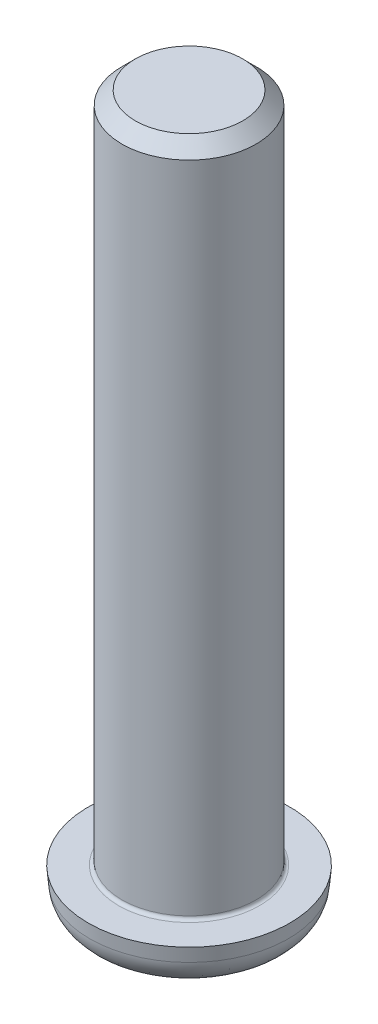
ISO-10303-21;
HEADER;
FILE_DESCRIPTION(('STEP AP214'),'2;1');
FILE_NAME('part.step','',(''),(''),'','','');
FILE_SCHEMA(('AUTOMOTIVE_DESIGN { 1 0 10303 214 1 1 1 1 }'));
ENDSEC;
DATA;
#1=APPLICATION_CONTEXT('core data for automotive mechanical design processes');
#2=APPLICATION_PROTOCOL_DEFINITION('international standard','automotive_design',2000,#1);
#3=PRODUCT_CONTEXT('',#1,'mechanical');
#4=PRODUCT('Part','Part','',(#3));
#5=PRODUCT_RELATED_PRODUCT_CATEGORY('part','',(#4));
#6=PRODUCT_DEFINITION_FORMATION('','',#4);
#7=PRODUCT_DEFINITION_CONTEXT('part definition',#1,'design');
#8=PRODUCT_DEFINITION('design','',#6,#7);
#9=PRODUCT_DEFINITION_SHAPE('','',#8);
#10=(LENGTH_UNIT() NAMED_UNIT(*) SI_UNIT(.MILLI.,.METRE.));
#11=(NAMED_UNIT(*) PLANE_ANGLE_UNIT() SI_UNIT($,.RADIAN.));
#12=(NAMED_UNIT(*) SI_UNIT($,.STERADIAN.) SOLID_ANGLE_UNIT());
#13=UNCERTAINTY_MEASURE_WITH_UNIT(LENGTH_MEASURE(1.E-05),#10,'distance_accuracy_value','');
#14=(GEOMETRIC_REPRESENTATION_CONTEXT(3) GLOBAL_UNCERTAINTY_ASSIGNED_CONTEXT((#13)) GLOBAL_UNIT_ASSIGNED_CONTEXT((#10,
#11,#12)) REPRESENTATION_CONTEXT('',''));
#15=CARTESIAN_POINT('',(0.,0.,0.));
#16=DIRECTION('',(0.,0.,1.));
#17=DIRECTION('',(1.,0.,0.));
#18=AXIS2_PLACEMENT_3D('',#15,#16,#17);
#19=CARTESIAN_POINT('',(0.,0.,1.));
#20=DIRECTION('',(0.,1.,0.));
#21=DIRECTION('',(0.,0.,1.));
#22=AXIS2_PLACEMENT_3D('',#19,#20,#21);
#23=PLANE('',#22);
#24=CARTESIAN_POINT('',(0.,0.,0.));
#25=DIRECTION('',(0.,1.,0.));
#26=DIRECTION('',(0.,0.,1.));
#27=AXIS2_PLACEMENT_3D('',#24,#25,#26);
#28=CIRCLE('',#27,1.05);
#29=CARTESIAN_POINT('',(0.,0.,1.05));
#30=VERTEX_POINT('',#29);
#31=EDGE_CURVE('E251',#30,#30,#28,.F.);
#32=ORIENTED_EDGE('',*,*,#31,.T.);
#33=EDGE_LOOP('',(#32));
#34=FACE_BOUND('',#33,.T.);
#35=CARTESIAN_POINT('',(0.,0.,0.));
#36=DIRECTION('',(0.,1.,0.));
#37=DIRECTION('',(0.,0.,1.));
#38=AXIS2_PLACEMENT_3D('',#35,#36,#37);
#39=CIRCLE('',#38,1.5);
#40=CARTESIAN_POINT('',(0.,0.,1.5));
#41=VERTEX_POINT('',#40);
#42=EDGE_CURVE('E239',#41,#41,#39,.T.);
#43=ORIENTED_EDGE('',*,*,#42,.T.);
#44=EDGE_LOOP('',(#43));
#45=FACE_BOUND('',#44,.T.);
#46=ADVANCED_FACE('F43',(#34,#45),#23,.T.);
#47=CARTESIAN_POINT('',(0.,0.,0.));
#48=DIRECTION('',(0.,1.,0.));
#49=DIRECTION('',(0.,0.,1.));
#50=AXIS2_PLACEMENT_3D('',#47,#48,#49);
#51=CONICAL_SURFACE('',#50,1.5,0.087266462599715);
#52=CARTESIAN_POINT('',(0.,-0.21,0.));
#53=DIRECTION('',(0.,1.,0.));
#54=DIRECTION('',(0.,0.,1.));
#55=AXIS2_PLACEMENT_3D('',#52,#53,#54);
#56=CIRCLE('',#55,1.48162738065956);
#57=CARTESIAN_POINT('',(0.,-0.21,1.48162738065956));
#58=VERTEX_POINT('',#57);
#59=EDGE_CURVE('E187',#58,#58,#56,.T.);
#60=ORIENTED_EDGE('',*,*,#59,.T.);
#61=EDGE_LOOP('',(#60));
#62=FACE_BOUND('',#61,.T.);
#63=ORIENTED_EDGE('',*,*,#42,.F.);
#64=EDGE_LOOP('',(#63));
#65=FACE_BOUND('',#64,.T.);
#66=ADVANCED_FACE('F268',(#62,#65),#51,.T.);
#67=CARTESIAN_POINT('',(0.,-0.169099911978679,0.));
#68=DIRECTION('',(0.,1.,0.));
#69=DIRECTION('',(0.,0.,1.));
#70=AXIS2_PLACEMENT_3D('',#67,#68,#69);
#71=TOROIDAL_SURFACE('',#70,1.01413723538831,0.469275881679299);
#72=CARTESIAN_POINT('',(0.,-0.571497043538653,0.));
#73=DIRECTION('',(0.,1.,0.));
#74=DIRECTION('',(0.,0.,1.));
#75=AXIS2_PLACEMENT_3D('',#72,#73,#74);
#76=CIRCLE('',#75,1.25558371318036);
#77=CARTESIAN_POINT('',(0.,-0.571497043538653,1.25558371318036));
#78=VERTEX_POINT('',#77);
#79=EDGE_CURVE('E242',#78,#78,#76,.T.);
#80=ORIENTED_EDGE('',*,*,#79,.T.);
#81=EDGE_LOOP('',(#80));
#82=FACE_BOUND('',#81,.T.);
#83=ORIENTED_EDGE('',*,*,#59,.F.);
#84=EDGE_LOOP('',(#83));
#85=FACE_BOUND('',#84,.T.);
#86=ADVANCED_FACE('F274',(#82,#85),#71,.T.);
#87=CARTESIAN_POINT('',(0.,-0.6,0.));
#88=DIRECTION('',(0.,-1.,0.));
#89=DIRECTION('',(0.,0.,-1.));
#90=AXIS2_PLACEMENT_3D('',#87,#88,#89);
#91=PLANE('',#90);
#92=DIRECTION('',(0.,0.,-1.));
#93=VECTOR('',#92,1.);
#94=CARTESIAN_POINT('',(-0.15725,-0.6,0.925));
#95=LINE('',#94,#93);
#96=CARTESIAN_POINT('',(-0.15725,-0.6,0.925));
#97=VERTEX_POINT('',#96);
#98=CARTESIAN_POINT('',(-0.15725,-0.6,0.15725));
#99=VERTEX_POINT('',#98);
#100=EDGE_CURVE('E58',#97,#99,#95,.T.);
#101=ORIENTED_EDGE('',*,*,#100,.F.);
#102=DIRECTION('',(-1.,0.,0.));
#103=VECTOR('',#102,1.);
#104=CARTESIAN_POINT('',(-0.15725,-0.6,0.925));
#105=LINE('',#104,#103);
#106=CARTESIAN_POINT('',(0.15725,-0.6,0.925));
#107=VERTEX_POINT('',#106);
#108=EDGE_CURVE('E183',#107,#97,#105,.T.);
#109=ORIENTED_EDGE('',*,*,#108,.F.);
#110=DIRECTION('',(0.,0.,1.));
#111=VECTOR('',#110,1.);
#112=CARTESIAN_POINT('',(0.15725,-0.6,0.925));
#113=LINE('',#112,#111);
#114=CARTESIAN_POINT('',(0.157250000000001,-0.6,0.15725));
#115=VERTEX_POINT('',#114);
#116=EDGE_CURVE('E181',#115,#107,#113,.T.);
#117=ORIENTED_EDGE('',*,*,#116,.F.);
#118=DIRECTION('',(-1.,0.,0.));
#119=VECTOR('',#118,1.);
#120=CARTESIAN_POINT('',(0.157250000000001,-0.6,0.15725));
#121=LINE('',#120,#119);
#122=CARTESIAN_POINT('',(0.925,-0.6,0.15725));
#123=VERTEX_POINT('',#122);
#124=EDGE_CURVE('E178',#123,#115,#121,.T.);
#125=ORIENTED_EDGE('',*,*,#124,.F.);
#126=DIRECTION('',(0.,0.,1.));
#127=VECTOR('',#126,1.);
#128=CARTESIAN_POINT('',(0.925,-0.6,0.15725));
#129=LINE('',#128,#127);
#130=CARTESIAN_POINT('',(0.925,-0.6,-0.15725));
#131=VERTEX_POINT('',#130);
#132=EDGE_CURVE('E175',#131,#123,#129,.T.);
#133=ORIENTED_EDGE('',*,*,#132,.F.);
#134=DIRECTION('',(1.,0.,0.));
#135=VECTOR('',#134,1.);
#136=CARTESIAN_POINT('',(0.157250000000001,-0.6,-0.15725));
#137=LINE('',#136,#135);
#138=CARTESIAN_POINT('',(0.157250000000001,-0.6,-0.15725));
#139=VERTEX_POINT('',#138);
#140=EDGE_CURVE('E172',#139,#131,#137,.T.);
#141=ORIENTED_EDGE('',*,*,#140,.F.);
#142=DIRECTION('',(0.,0.,1.));
#143=VECTOR('',#142,1.);
#144=CARTESIAN_POINT('',(0.157250000000001,-0.6,-0.15725));
#145=LINE('',#144,#143);
#146=CARTESIAN_POINT('',(0.157250000000001,-0.6,-0.925));
#147=VERTEX_POINT('',#146);
#148=EDGE_CURVE('E169',#147,#139,#145,.T.);
#149=ORIENTED_EDGE('',*,*,#148,.F.);
#150=DIRECTION('',(1.,0.,0.));
#151=VECTOR('',#150,1.);
#152=CARTESIAN_POINT('',(-0.15725,-0.6,-0.925));
#153=LINE('',#152,#151);
#154=CARTESIAN_POINT('',(-0.15725,-0.6,-0.925));
#155=VERTEX_POINT('',#154);
#156=EDGE_CURVE('E166',#155,#147,#153,.T.);
#157=ORIENTED_EDGE('',*,*,#156,.F.);
#158=DIRECTION('',(0.,0.,-1.));
#159=VECTOR('',#158,1.);
#160=CARTESIAN_POINT('',(-0.15725,-0.6,-0.15725));
#161=LINE('',#160,#159);
#162=CARTESIAN_POINT('',(-0.15725,-0.6,-0.15725));
#163=VERTEX_POINT('',#162);
#164=EDGE_CURVE('E160',#163,#155,#161,.T.);
#165=ORIENTED_EDGE('',*,*,#164,.F.);
#166=DIRECTION('',(1.,0.,0.));
#167=VECTOR('',#166,1.);
#168=CARTESIAN_POINT('',(-0.925,-0.6,-0.15725));
#169=LINE('',#168,#167);
#170=CARTESIAN_POINT('',(-0.925,-0.6,-0.15725));
#171=VERTEX_POINT('',#170);
#172=EDGE_CURVE('E158',#171,#163,#169,.T.);
#173=ORIENTED_EDGE('',*,*,#172,.F.);
#174=DIRECTION('',(0.,0.,-1.));
#175=VECTOR('',#174,1.);
#176=CARTESIAN_POINT('',(-0.925,-0.6,0.15725));
#177=LINE('',#176,#175);
#178=CARTESIAN_POINT('',(-0.925,-0.6,0.15725));
#179=VERTEX_POINT('',#178);
#180=EDGE_CURVE('E141',#179,#171,#177,.T.);
#181=ORIENTED_EDGE('',*,*,#180,.F.);
#182=DIRECTION('',(-1.,0.,0.));
#183=VECTOR('',#182,1.);
#184=CARTESIAN_POINT('',(-0.925,-0.6,0.15725));
#185=LINE('',#184,#183);
#186=EDGE_CURVE('E150',#99,#179,#185,.T.);
#187=ORIENTED_EDGE('',*,*,#186,.F.);
#188=EDGE_LOOP('',(#101,#109,#117,#125,#133,#141,#149,#157,#165,#173,#181,#187));
#189=FACE_BOUND('',#188,.T.);
#190=CARTESIAN_POINT('',(0.,-0.6,0.));
#191=DIRECTION('',(0.,-1.,0.));
#192=DIRECTION('',(0.,0.,-1.));
#193=AXIS2_PLACEMENT_3D('',#190,#191,#192);
#194=CIRCLE('',#193,1.15268199279872);
#195=CARTESIAN_POINT('',(0.,-0.6,-1.15268199279872));
#196=VERTEX_POINT('',#195);
#197=EDGE_CURVE('E245',#196,#196,#194,.T.);
#198=ORIENTED_EDGE('',*,*,#197,.T.);
#199=EDGE_LOOP('',(#198));
#200=FACE_BOUND('',#199,.T.);
#201=ADVANCED_FACE('F154',(#189,#200),#91,.T.);
#202=CARTESIAN_POINT('',(0.,10.,1.));
#203=DIRECTION('',(0.,1.,0.));
#204=DIRECTION('',(0.,0.,1.));
#205=AXIS2_PLACEMENT_3D('',#202,#203,#204);
#206=PLANE('',#205);
#207=CARTESIAN_POINT('',(0.,10.,0.));
#208=DIRECTION('',(0.,1.,0.));
#209=DIRECTION('',(0.,0.,1.));
#210=AXIS2_PLACEMENT_3D('',#207,#208,#209);
#211=CIRCLE('',#210,0.8);
#212=CARTESIAN_POINT('',(0.,10.,0.800000000000001));
#213=VERTEX_POINT('',#212);
#214=EDGE_CURVE('E51',#213,#213,#211,.T.);
#215=ORIENTED_EDGE('',*,*,#214,.T.);
#216=EDGE_LOOP('',(#215));
#217=FACE_BOUND('',#216,.T.);
#218=ADVANCED_FACE('F256',(#217),#206,.T.);
#219=CARTESIAN_POINT('',(0.,10.,0.));
#220=DIRECTION('',(0.,1.,0.));
#221=DIRECTION('',(0.,0.,1.));
#222=AXIS2_PLACEMENT_3D('',#219,#220,#221);
#223=CYLINDRICAL_SURFACE('',#222,1.);
#224=CARTESIAN_POINT('',(0.,9.8,0.));
#225=DIRECTION('',(0.,1.,0.));
#226=DIRECTION('',(0.,0.,1.));
#227=AXIS2_PLACEMENT_3D('',#224,#225,#226);
#228=CIRCLE('',#227,1.);
#229=CARTESIAN_POINT('',(0.,9.8,1.));
#230=VERTEX_POINT('',#229);
#231=EDGE_CURVE('E11',#230,#230,#228,.F.);
#232=ORIENTED_EDGE('',*,*,#231,.T.);
#233=EDGE_LOOP('',(#232));
#234=FACE_BOUND('',#233,.T.);
#235=CARTESIAN_POINT('',(0.,0.0499999999999997,0.));
#236=DIRECTION('',(0.,1.,0.));
#237=DIRECTION('',(0.,0.,1.));
#238=AXIS2_PLACEMENT_3D('',#235,#236,#237);
#239=CIRCLE('',#238,1.);
#240=CARTESIAN_POINT('',(0.,0.0499999999999996,0.999999999999999));
#241=VERTEX_POINT('',#240);
#242=EDGE_CURVE('E248',#241,#241,#239,.T.);
#243=ORIENTED_EDGE('',*,*,#242,.T.);
#244=EDGE_LOOP('',(#243));
#245=FACE_BOUND('',#244,.T.);
#246=ADVANCED_FACE('F283',(#234,#245),#223,.T.);
#247=CARTESIAN_POINT('',(0.,-0.4,0.));
#248=DIRECTION('',(0.,-1.,0.));
#249=DIRECTION('',(0.,0.,-1.));
#250=AXIS2_PLACEMENT_3D('',#247,#248,#249);
#251=TOROIDAL_SURFACE('',#250,1.15268199279872,0.2);
#252=ORIENTED_EDGE('',*,*,#197,.F.);
#253=EDGE_LOOP('',(#252));
#254=FACE_BOUND('',#253,.T.);
#255=ORIENTED_EDGE('',*,*,#79,.F.);
#256=EDGE_LOOP('',(#255));
#257=FACE_BOUND('',#256,.T.);
#258=ADVANCED_FACE('F280',(#254,#257),#251,.T.);
#259=CARTESIAN_POINT('',(-0.15725,-0.6,0.925));
#260=DIRECTION('',(-0.998629534754574,0.0523359562429439,0.));
#261=DIRECTION('',(-0.052335956242944,-0.998629534754574,0.));
#262=AXIS2_PLACEMENT_3D('',#259,#260,#261);
#263=PLANE('',#262);
#264=ORIENTED_EDGE('',*,*,#100,.T.);
#265=DIRECTION('',(-0.052264427688714,-0.997264688634237,0.0522644276887139));
#266=VECTOR('',#265,1.);
#267=CARTESIAN_POINT('',(-0.159347163175851,-0.640016257214874,0.15934716317585));
#268=LINE('',#267,#266);
#269=CARTESIAN_POINT('',(-0.090692120310538,0.67,0.0906921203105376));
#270=VERTEX_POINT('',#269);
#271=EDGE_CURVE('E101',#270,#99,#268,.T.);
#272=ORIENTED_EDGE('',*,*,#271,.F.);
#273=DIRECTION('',(0.,0.,-1.));
#274=VECTOR('',#273,1.);
#275=CARTESIAN_POINT('',(-0.090692120310538,0.67,-0.15725));
#276=LINE('',#275,#274);
#277=CARTESIAN_POINT('',(-0.0906921203105379,0.67,0.858442120310538));
#278=VERTEX_POINT('',#277);
#279=EDGE_CURVE('E185',#278,#270,#276,.T.);
#280=ORIENTED_EDGE('',*,*,#279,.F.);
#281=DIRECTION('',(-0.052264427688714,-0.997264688634237,0.0522644276887139));
#282=VECTOR('',#281,1.);
#283=CARTESIAN_POINT('',(-0.15725,-0.6,0.925));
#284=LINE('',#283,#282);
#285=EDGE_CURVE('E66',#278,#97,#284,.T.);
#286=ORIENTED_EDGE('',*,*,#285,.T.);
#287=EDGE_LOOP('',(#264,#272,#280,#286));
#288=FACE_BOUND('',#287,.T.);
#289=ADVANCED_FACE('F282',(#288),#263,.F.);
#290=CARTESIAN_POINT('',(-0.15725,-0.6,0.925));
#291=DIRECTION('',(0.,0.0523359562429438,0.998629534754574));
#292=DIRECTION('',(0.,-0.998629534754574,0.0523359562429438));
#293=AXIS2_PLACEMENT_3D('',#290,#291,#292);
#294=PLANE('',#293);
#295=ORIENTED_EDGE('',*,*,#108,.T.);
#296=ORIENTED_EDGE('',*,*,#285,.F.);
#297=DIRECTION('',(-1.,0.,0.));
#298=VECTOR('',#297,1.);
#299=CARTESIAN_POINT('',(-0.15725,0.67,0.858442120310538));
#300=LINE('',#299,#298);
#301=CARTESIAN_POINT('',(0.0906921203105374,0.67,0.858442120310538));
#302=VERTEX_POINT('',#301);
#303=EDGE_CURVE('E188',#302,#278,#300,.T.);
#304=ORIENTED_EDGE('',*,*,#303,.F.);
#305=DIRECTION('',(0.052264427688714,-0.997264688634237,0.0522644276887139));
#306=VECTOR('',#305,1.);
#307=CARTESIAN_POINT('',(0.15725,-0.6,0.925));
#308=LINE('',#307,#306);
#309=EDGE_CURVE('E106',#302,#107,#308,.T.);
#310=ORIENTED_EDGE('',*,*,#309,.T.);
#311=EDGE_LOOP('',(#295,#296,#304,#310));
#312=FACE_BOUND('',#311,.T.);
#313=ADVANCED_FACE('F289',(#312),#294,.F.);
#314=CARTESIAN_POINT('',(0.15725,-0.6,0.925));
#315=DIRECTION('',(0.998629534754574,0.0523359562429439,0.));
#316=DIRECTION('',(-0.052335956242944,0.998629534754574,0.));
#317=AXIS2_PLACEMENT_3D('',#314,#315,#316);
#318=PLANE('',#317);
#319=ORIENTED_EDGE('',*,*,#116,.T.);
#320=ORIENTED_EDGE('',*,*,#309,.F.);
#321=DIRECTION('',(0.,0.,1.));
#322=VECTOR('',#321,1.);
#323=CARTESIAN_POINT('',(0.090692120310539,0.67,-0.15725));
#324=LINE('',#323,#322);
#325=CARTESIAN_POINT('',(0.0906921203105386,0.67,0.0906921203105376));
#326=VERTEX_POINT('',#325);
#327=EDGE_CURVE('E211',#326,#302,#324,.T.);
#328=ORIENTED_EDGE('',*,*,#327,.F.);
#329=DIRECTION('',(0.052264427688714,-0.997264688634237,0.0522644276887139));
#330=VECTOR('',#329,1.);
#331=CARTESIAN_POINT('',(0.159347163175851,-0.640016257214874,0.15934716317585));
#332=LINE('',#331,#330);
#333=EDGE_CURVE('E203',#326,#115,#332,.T.);
#334=ORIENTED_EDGE('',*,*,#333,.T.);
#335=EDGE_LOOP('',(#319,#320,#328,#334));
#336=FACE_BOUND('',#335,.T.);
#337=ADVANCED_FACE('F311',(#336),#318,.F.);
#338=CARTESIAN_POINT('',(0.157250000000001,-0.6,0.15725));
#339=DIRECTION('',(0.,0.0523359562429438,0.998629534754574));
#340=DIRECTION('',(0.,-0.998629534754574,0.0523359562429438));
#341=AXIS2_PLACEMENT_3D('',#338,#339,#340);
#342=PLANE('',#341);
#343=ORIENTED_EDGE('',*,*,#124,.T.);
#344=ORIENTED_EDGE('',*,*,#333,.F.);
#345=DIRECTION('',(-1.,0.,0.));
#346=VECTOR('',#345,1.);
#347=CARTESIAN_POINT('',(-0.15725,0.67,0.0906921203105376));
#348=LINE('',#347,#346);
#349=CARTESIAN_POINT('',(0.858442120310538,0.67,0.0906921203105376));
#350=VERTEX_POINT('',#349);
#351=EDGE_CURVE('E214',#350,#326,#348,.T.);
#352=ORIENTED_EDGE('',*,*,#351,.F.);
#353=DIRECTION('',(0.052264427688714,-0.997264688634237,0.0522644276887139));
#354=VECTOR('',#353,1.);
#355=CARTESIAN_POINT('',(0.925,-0.6,0.15725));
#356=LINE('',#355,#354);
#357=EDGE_CURVE('E201',#350,#123,#356,.T.);
#358=ORIENTED_EDGE('',*,*,#357,.T.);
#359=EDGE_LOOP('',(#343,#344,#352,#358));
#360=FACE_BOUND('',#359,.T.);
#361=ADVANCED_FACE('F314',(#360),#342,.F.);
#362=CARTESIAN_POINT('',(0.925,-0.6,0.15725));
#363=DIRECTION('',(0.998629534754574,0.0523359562429439,0.));
#364=DIRECTION('',(-0.052335956242944,0.998629534754574,0.));
#365=AXIS2_PLACEMENT_3D('',#362,#363,#364);
#366=PLANE('',#365);
#367=ORIENTED_EDGE('',*,*,#132,.T.);
#368=ORIENTED_EDGE('',*,*,#357,.F.);
#369=DIRECTION('',(0.,0.,1.));
#370=VECTOR('',#369,1.);
#371=CARTESIAN_POINT('',(0.858442120310538,0.67,-0.15725));
#372=LINE('',#371,#370);
#373=CARTESIAN_POINT('',(0.858442120310538,0.67,-0.0906921203105375));
#374=VERTEX_POINT('',#373);
#375=EDGE_CURVE('E217',#374,#350,#372,.T.);
#376=ORIENTED_EDGE('',*,*,#375,.F.);
#377=DIRECTION('',(0.052264427688714,-0.997264688634237,-0.0522644276887142));
#378=VECTOR('',#377,1.);
#379=CARTESIAN_POINT('',(0.92290283682415,-0.559983742785126,-0.15515283682415));
#380=LINE('',#379,#378);
#381=EDGE_CURVE('E199',#374,#131,#380,.T.);
#382=ORIENTED_EDGE('',*,*,#381,.T.);
#383=EDGE_LOOP('',(#367,#368,#376,#382));
#384=FACE_BOUND('',#383,.T.);
#385=ADVANCED_FACE('F318',(#384),#366,.F.);
#386=CARTESIAN_POINT('',(0.157250000000001,-0.6,-0.15725));
#387=DIRECTION('',(0.,0.0523359562429441,-0.998629534754574));
#388=DIRECTION('',(0.,0.998629534754574,0.0523359562429441));
#389=AXIS2_PLACEMENT_3D('',#386,#387,#388);
#390=PLANE('',#389);
#391=ORIENTED_EDGE('',*,*,#140,.T.);
#392=ORIENTED_EDGE('',*,*,#381,.F.);
#393=DIRECTION('',(1.,0.,0.));
#394=VECTOR('',#393,1.);
#395=CARTESIAN_POINT('',(-0.15725,0.67,-0.0906921203105374));
#396=LINE('',#395,#394);
#397=CARTESIAN_POINT('',(0.0906921203105385,0.67,-0.0906921203105374));
#398=VERTEX_POINT('',#397);
#399=EDGE_CURVE('E220',#398,#374,#396,.T.);
#400=ORIENTED_EDGE('',*,*,#399,.F.);
#401=DIRECTION('',(0.0522644276887141,-0.997264688634237,-0.0522644276887142));
#402=VECTOR('',#401,1.);
#403=CARTESIAN_POINT('',(0.157250000000001,-0.6,-0.15725));
#404=LINE('',#403,#402);
#405=EDGE_CURVE('E197',#398,#139,#404,.T.);
#406=ORIENTED_EDGE('',*,*,#405,.T.);
#407=EDGE_LOOP('',(#391,#392,#400,#406));
#408=FACE_BOUND('',#407,.T.);
#409=ADVANCED_FACE('F322',(#408),#390,.F.);
#410=CARTESIAN_POINT('',(0.157250000000001,-0.6,-0.15725));
#411=DIRECTION('',(0.998629534754574,0.0523359562429439,0.));
#412=DIRECTION('',(-0.052335956242944,0.998629534754574,0.));
#413=AXIS2_PLACEMENT_3D('',#410,#411,#412);
#414=PLANE('',#413);
#415=ORIENTED_EDGE('',*,*,#148,.T.);
#416=ORIENTED_EDGE('',*,*,#405,.F.);
#417=DIRECTION('',(0.,0.,1.));
#418=VECTOR('',#417,1.);
#419=CARTESIAN_POINT('',(0.0906921203105385,0.67,-0.15725));
#420=LINE('',#419,#418);
#421=CARTESIAN_POINT('',(0.0906921203105386,0.67,-0.858442120310538));
#422=VERTEX_POINT('',#421);
#423=EDGE_CURVE('E223',#422,#398,#420,.T.);
#424=ORIENTED_EDGE('',*,*,#423,.F.);
#425=DIRECTION('',(0.0522644276887141,-0.997264688634237,-0.0522644276887142));
#426=VECTOR('',#425,1.);
#427=CARTESIAN_POINT('',(0.156390921108689,-0.583607798249329,-0.924140921108688));
#428=LINE('',#427,#426);
#429=EDGE_CURVE('E195',#422,#147,#428,.T.);
#430=ORIENTED_EDGE('',*,*,#429,.T.);
#431=EDGE_LOOP('',(#415,#416,#424,#430));
#432=FACE_BOUND('',#431,.T.);
#433=ADVANCED_FACE('F326',(#432),#414,.F.);
#434=CARTESIAN_POINT('',(-0.15725,-0.6,-0.925));
#435=DIRECTION('',(0.,0.0523359562429441,-0.998629534754574));
#436=DIRECTION('',(0.,0.998629534754574,0.0523359562429441));
#437=AXIS2_PLACEMENT_3D('',#434,#435,#436);
#438=PLANE('',#437);
#439=ORIENTED_EDGE('',*,*,#156,.T.);
#440=ORIENTED_EDGE('',*,*,#429,.F.);
#441=DIRECTION('',(1.,0.,0.));
#442=VECTOR('',#441,1.);
#443=CARTESIAN_POINT('',(-0.15725,0.67,-0.858442120310538));
#444=LINE('',#443,#442);
#445=CARTESIAN_POINT('',(-0.0906921203105378,0.67,-0.858442120310538));
#446=VERTEX_POINT('',#445);
#447=EDGE_CURVE('E226',#446,#422,#444,.T.);
#448=ORIENTED_EDGE('',*,*,#447,.F.);
#449=DIRECTION('',(-0.052264427688714,-0.997264688634237,-0.0522644276887142));
#450=VECTOR('',#449,1.);
#451=CARTESIAN_POINT('',(-0.15515283682415,-0.559983742785126,-0.92290283682415));
#452=LINE('',#451,#450);
#453=EDGE_CURVE('E193',#446,#155,#452,.T.);
#454=ORIENTED_EDGE('',*,*,#453,.T.);
#455=EDGE_LOOP('',(#439,#440,#448,#454));
#456=FACE_BOUND('',#455,.T.);
#457=ADVANCED_FACE('F330',(#456),#438,.F.);
#458=CARTESIAN_POINT('',(-0.15725,-0.6,-0.15725));
#459=DIRECTION('',(-0.998629534754574,0.0523359562429439,0.));
#460=DIRECTION('',(-0.052335956242944,-0.998629534754574,0.));
#461=AXIS2_PLACEMENT_3D('',#458,#459,#460);
#462=PLANE('',#461);
#463=ORIENTED_EDGE('',*,*,#164,.T.);
#464=ORIENTED_EDGE('',*,*,#453,.F.);
#465=DIRECTION('',(0.,0.,-1.));
#466=VECTOR('',#465,1.);
#467=CARTESIAN_POINT('',(-0.0906921203105379,0.67,-0.15725));
#468=LINE('',#467,#466);
#469=CARTESIAN_POINT('',(-0.0906921203105379,0.67,-0.0906921203105375));
#470=VERTEX_POINT('',#469);
#471=EDGE_CURVE('E229',#470,#446,#468,.T.);
#472=ORIENTED_EDGE('',*,*,#471,.F.);
#473=DIRECTION('',(-0.052264427688714,-0.997264688634237,-0.0522644276887142));
#474=VECTOR('',#473,1.);
#475=CARTESIAN_POINT('',(-0.15725,-0.6,-0.15725));
#476=LINE('',#475,#474);
#477=EDGE_CURVE('E191',#470,#163,#476,.T.);
#478=ORIENTED_EDGE('',*,*,#477,.T.);
#479=EDGE_LOOP('',(#463,#464,#472,#478));
#480=FACE_BOUND('',#479,.T.);
#481=ADVANCED_FACE('F334',(#480),#462,.F.);
#482=CARTESIAN_POINT('',(-0.925,-0.6,-0.15725));
#483=DIRECTION('',(0.,0.0523359562429441,-0.998629534754574));
#484=DIRECTION('',(0.,0.998629534754574,0.0523359562429441));
#485=AXIS2_PLACEMENT_3D('',#482,#483,#484);
#486=PLANE('',#485);
#487=ORIENTED_EDGE('',*,*,#172,.T.);
#488=ORIENTED_EDGE('',*,*,#477,.F.);
#489=DIRECTION('',(1.,0.,0.));
#490=VECTOR('',#489,1.);
#491=CARTESIAN_POINT('',(-0.15725,0.67,-0.0906921203105375));
#492=LINE('',#491,#490);
#493=CARTESIAN_POINT('',(-0.858442120310538,0.67,-0.0906921203105376));
#494=VERTEX_POINT('',#493);
#495=EDGE_CURVE('E232',#494,#470,#492,.T.);
#496=ORIENTED_EDGE('',*,*,#495,.F.);
#497=DIRECTION('',(-0.0522644276887141,-0.997264688634237,-0.0522644276887142));
#498=VECTOR('',#497,1.);
#499=CARTESIAN_POINT('',(-0.924140921108688,-0.583607798249329,-0.156390921108688));
#500=LINE('',#499,#498);
#501=EDGE_CURVE('E147',#494,#171,#500,.T.);
#502=ORIENTED_EDGE('',*,*,#501,.T.);
#503=EDGE_LOOP('',(#487,#488,#496,#502));
#504=FACE_BOUND('',#503,.T.);
#505=ADVANCED_FACE('F338',(#504),#486,.F.);
#506=CARTESIAN_POINT('',(-0.925,-0.6,0.15725));
#507=DIRECTION('',(-0.998629534754574,0.0523359562429439,0.));
#508=DIRECTION('',(-0.052335956242944,-0.998629534754574,0.));
#509=AXIS2_PLACEMENT_3D('',#506,#507,#508);
#510=PLANE('',#509);
#511=ORIENTED_EDGE('',*,*,#180,.T.);
#512=ORIENTED_EDGE('',*,*,#501,.F.);
#513=DIRECTION('',(0.,0.,-1.));
#514=VECTOR('',#513,1.);
#515=CARTESIAN_POINT('',(-0.858442120310538,0.67,-0.157249999999999));
#516=LINE('',#515,#514);
#517=CARTESIAN_POINT('',(-0.858442120310537,0.67,0.0906921203105374));
#518=VERTEX_POINT('',#517);
#519=EDGE_CURVE('E144',#518,#494,#516,.T.);
#520=ORIENTED_EDGE('',*,*,#519,.F.);
#521=DIRECTION('',(-0.052264427688714,-0.997264688634237,0.0522644276887139));
#522=VECTOR('',#521,1.);
#523=CARTESIAN_POINT('',(-0.925,-0.6,0.15725));
#524=LINE('',#523,#522);
#525=EDGE_CURVE('E137',#518,#179,#524,.T.);
#526=ORIENTED_EDGE('',*,*,#525,.T.);
#527=EDGE_LOOP('',(#511,#512,#520,#526));
#528=FACE_BOUND('',#527,.T.);
#529=ADVANCED_FACE('F139',(#528),#510,.F.);
#530=CARTESIAN_POINT('',(-0.925,-0.6,0.15725));
#531=DIRECTION('',(0.,0.0523359562429438,0.998629534754574));
#532=DIRECTION('',(0.,-0.998629534754574,0.0523359562429438));
#533=AXIS2_PLACEMENT_3D('',#530,#531,#532);
#534=PLANE('',#533);
#535=ORIENTED_EDGE('',*,*,#186,.T.);
#536=ORIENTED_EDGE('',*,*,#525,.F.);
#537=DIRECTION('',(-1.,0.,0.));
#538=VECTOR('',#537,1.);
#539=CARTESIAN_POINT('',(-0.15725,0.67,0.0906921203105376));
#540=LINE('',#539,#538);
#541=EDGE_CURVE('E208',#270,#518,#540,.T.);
#542=ORIENTED_EDGE('',*,*,#541,.F.);
#543=ORIENTED_EDGE('',*,*,#271,.T.);
#544=EDGE_LOOP('',(#535,#536,#542,#543));
#545=FACE_BOUND('',#544,.T.);
#546=ADVANCED_FACE('F151',(#545),#534,.F.);
#547=CARTESIAN_POINT('',(-0.15725,0.67,-0.15725));
#548=DIRECTION('',(0.,-1.,0.));
#549=DIRECTION('',(0.,0.,-1.));
#550=AXIS2_PLACEMENT_3D('',#547,#548,#549);
#551=PLANE('',#550);
#552=ORIENTED_EDGE('',*,*,#279,.T.);
#553=ORIENTED_EDGE('',*,*,#541,.T.);
#554=ORIENTED_EDGE('',*,*,#519,.T.);
#555=ORIENTED_EDGE('',*,*,#495,.T.);
#556=ORIENTED_EDGE('',*,*,#471,.T.);
#557=ORIENTED_EDGE('',*,*,#447,.T.);
#558=ORIENTED_EDGE('',*,*,#423,.T.);
#559=ORIENTED_EDGE('',*,*,#399,.T.);
#560=ORIENTED_EDGE('',*,*,#375,.T.);
#561=ORIENTED_EDGE('',*,*,#351,.T.);
#562=ORIENTED_EDGE('',*,*,#327,.T.);
#563=ORIENTED_EDGE('',*,*,#303,.T.);
#564=EDGE_LOOP('',(#552,#553,#554,#555,#556,#557,#558,#559,#560,#561,#562,#563));
#565=FACE_BOUND('',#564,.T.);
#566=ADVANCED_FACE('F264',(#565),#551,.T.);
#567=CARTESIAN_POINT('',(0.,0.0499999999999997,0.));
#568=DIRECTION('',(0.,1.,0.));
#569=DIRECTION('',(0.,0.,1.));
#570=AXIS2_PLACEMENT_3D('',#567,#568,#569);
#571=TOROIDAL_SURFACE('',#570,1.05,0.05);
#572=ORIENTED_EDGE('',*,*,#31,.F.);
#573=EDGE_LOOP('',(#572));
#574=FACE_BOUND('',#573,.T.);
#575=ORIENTED_EDGE('',*,*,#242,.F.);
#576=EDGE_LOOP('',(#575));
#577=FACE_BOUND('',#576,.T.);
#578=ADVANCED_FACE('F259',(#574,#577),#571,.F.);
#579=CARTESIAN_POINT('',(0.,10.,0.));
#580=DIRECTION('',(0.,-1.,0.));
#581=DIRECTION('',(0.,0.,-1.));
#582=AXIS2_PLACEMENT_3D('',#579,#580,#581);
#583=CONICAL_SURFACE('',#582,0.8,0.78539816339745);
#584=ORIENTED_EDGE('',*,*,#231,.F.);
#585=EDGE_LOOP('',(#584));
#586=FACE_BOUND('',#585,.T.);
#587=ORIENTED_EDGE('',*,*,#214,.F.);
#588=EDGE_LOOP('',(#587));
#589=FACE_BOUND('',#588,.T.);
#590=ADVANCED_FACE('F45',(#586,#589),#583,.T.);
#591=CLOSED_SHELL('',(#46,#66,#86,#201,#218,#246,#258,#289,#313,#337,#361,#385,#409,#433,#457,
#481,#505,#529,#546,#566,#578,#590));
#592=MANIFOLD_SOLID_BREP('B2',#591);
#593=ADVANCED_BREP_SHAPE_REPRESENTATION('',(#18,#592),#14);
#594=SHAPE_DEFINITION_REPRESENTATION(#9,#593);
ENDSEC;
END-ISO-10303-21;
